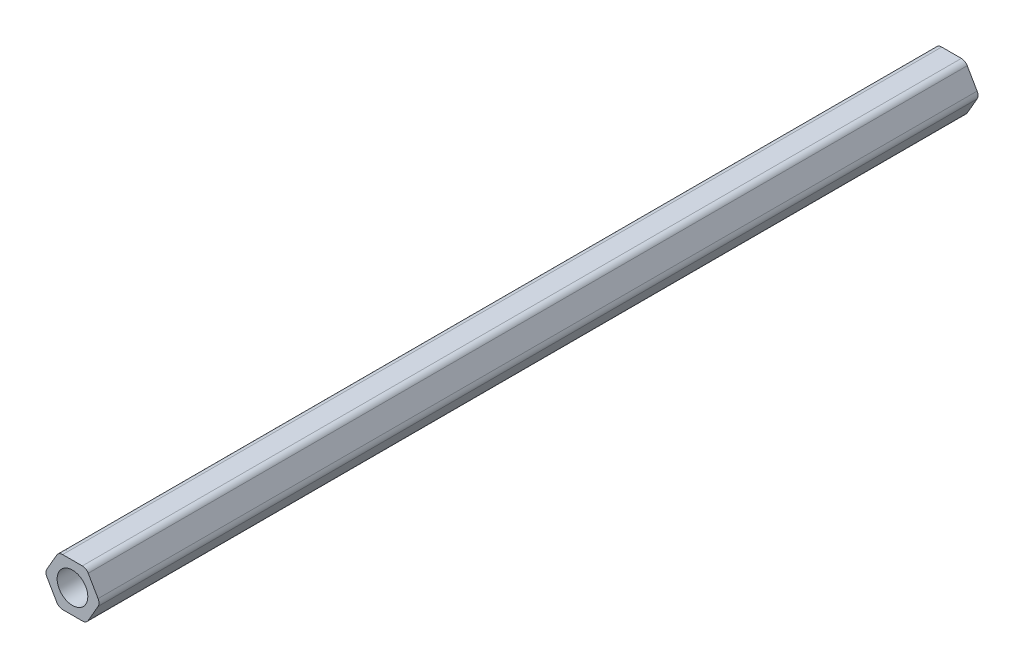
ISO-10303-21;
HEADER;
FILE_DESCRIPTION(('STEP AP214'),'2;1');
FILE_NAME('part.step','',(''),(''),'','','');
FILE_SCHEMA(('AUTOMOTIVE_DESIGN { 1 0 10303 214 1 1 1 1 }'));
ENDSEC;
DATA;
#1=APPLICATION_CONTEXT('core data for automotive mechanical design processes');
#2=APPLICATION_PROTOCOL_DEFINITION('international standard','automotive_design',2000,#1);
#3=PRODUCT_CONTEXT('',#1,'mechanical');
#4=PRODUCT('Part','Part','',(#3));
#5=PRODUCT_RELATED_PRODUCT_CATEGORY('part','',(#4));
#6=PRODUCT_DEFINITION_FORMATION('','',#4);
#7=PRODUCT_DEFINITION_CONTEXT('part definition',#1,'design');
#8=PRODUCT_DEFINITION('design','',#6,#7);
#9=PRODUCT_DEFINITION_SHAPE('','',#8);
#10=(LENGTH_UNIT() NAMED_UNIT(*) SI_UNIT(.MILLI.,.METRE.));
#11=(NAMED_UNIT(*) PLANE_ANGLE_UNIT() SI_UNIT($,.RADIAN.));
#12=(NAMED_UNIT(*) SI_UNIT($,.STERADIAN.) SOLID_ANGLE_UNIT());
#13=UNCERTAINTY_MEASURE_WITH_UNIT(LENGTH_MEASURE(1.E-05),#10,'distance_accuracy_value','');
#14=(GEOMETRIC_REPRESENTATION_CONTEXT(3) GLOBAL_UNCERTAINTY_ASSIGNED_CONTEXT((#13)) GLOBAL_UNIT_ASSIGNED_CONTEXT((#10,
#11,#12)) REPRESENTATION_CONTEXT('',''));
#15=CARTESIAN_POINT('',(0.,0.,0.));
#16=DIRECTION('',(0.,0.,1.));
#17=DIRECTION('',(1.,0.,0.));
#18=AXIS2_PLACEMENT_3D('',#15,#16,#17);
#19=CARTESIAN_POINT('',(-2.88675134594813,0.,129.));
#20=DIRECTION('',(0.,0.,-1.));
#21=DIRECTION('',(-1.,0.,0.));
#22=AXIS2_PLACEMENT_3D('',#19,#20,#21);
#23=CYLINDRICAL_SURFACE('',#22,1.);
#24=CARTESIAN_POINT('',(-2.88675134594813,0.,0.));
#25=DIRECTION('',(0.,0.,1.));
#26=DIRECTION('',(1.,0.,0.));
#27=AXIS2_PLACEMENT_3D('',#24,#25,#26);
#28=CIRCLE('',#27,1.);
#29=CARTESIAN_POINT('',(-3.75277674973257,0.500000000000003,0.));
#30=VERTEX_POINT('',#29);
#31=CARTESIAN_POINT('',(-3.75277674973257,-0.500000000000004,0.));
#32=VERTEX_POINT('',#31);
#33=EDGE_CURVE('E153',#30,#32,#28,.T.);
#34=ORIENTED_EDGE('',*,*,#33,.T.);
#35=DIRECTION('',(0.,0.,-1.));
#36=VECTOR('',#35,1.);
#37=CARTESIAN_POINT('',(-3.75277674973257,-0.500000000000004,129.));
#38=LINE('',#37,#36);
#39=CARTESIAN_POINT('',(-3.75277674973257,-0.500000000000004,129.));
#40=VERTEX_POINT('',#39);
#41=EDGE_CURVE('E11',#40,#32,#38,.T.);
#42=ORIENTED_EDGE('',*,*,#41,.F.);
#43=CARTESIAN_POINT('',(-2.88675134594813,0.,129.));
#44=DIRECTION('',(0.,0.,1.));
#45=DIRECTION('',(1.,0.,0.));
#46=AXIS2_PLACEMENT_3D('',#43,#44,#45);
#47=CIRCLE('',#46,1.);
#48=CARTESIAN_POINT('',(-3.75277674973257,0.500000000000003,129.));
#49=VERTEX_POINT('',#48);
#50=EDGE_CURVE('E176',#49,#40,#47,.T.);
#51=ORIENTED_EDGE('',*,*,#50,.F.);
#52=DIRECTION('',(0.,0.,-1.));
#53=VECTOR('',#52,1.);
#54=CARTESIAN_POINT('',(-3.75277674973257,0.500000000000003,129.));
#55=LINE('',#54,#53);
#56=EDGE_CURVE('E149',#49,#30,#55,.T.);
#57=ORIENTED_EDGE('',*,*,#56,.T.);
#58=EDGE_LOOP('',(#34,#42,#51,#57));
#59=FACE_BOUND('',#58,.T.);
#60=ADVANCED_FACE('F33',(#59),#23,.T.);
#61=CARTESIAN_POINT('',(-3.75277674973257,-0.500000000000004,129.));
#62=DIRECTION('',(0.866025403784439,0.5,0.));
#63=DIRECTION('',(-0.5,0.866025403784439,0.));
#64=AXIS2_PLACEMENT_3D('',#61,#62,#63);
#65=PLANE('',#64);
#66=DIRECTION('',(0.5,-0.866025403784439,0.));
#67=VECTOR('',#66,1.);
#68=CARTESIAN_POINT('',(-3.75277674973257,-0.500000000000004,0.));
#69=LINE('',#68,#67);
#70=CARTESIAN_POINT('',(-2.30940107675851,-3.,0.));
#71=VERTEX_POINT('',#70);
#72=EDGE_CURVE('E156',#32,#71,#69,.T.);
#73=ORIENTED_EDGE('',*,*,#72,.T.);
#74=DIRECTION('',(0.,0.,-1.));
#75=VECTOR('',#74,1.);
#76=CARTESIAN_POINT('',(-2.30940107675851,-3.,129.));
#77=LINE('',#76,#75);
#78=CARTESIAN_POINT('',(-2.30940107675851,-3.,129.));
#79=VERTEX_POINT('',#78);
#80=EDGE_CURVE('E41',#79,#71,#77,.T.);
#81=ORIENTED_EDGE('',*,*,#80,.F.);
#82=DIRECTION('',(0.5,-0.866025403784439,0.));
#83=VECTOR('',#82,1.);
#84=CARTESIAN_POINT('',(-3.75277674973257,-0.500000000000004,129.));
#85=LINE('',#84,#83);
#86=EDGE_CURVE('E104',#40,#79,#85,.T.);
#87=ORIENTED_EDGE('',*,*,#86,.F.);
#88=ORIENTED_EDGE('',*,*,#41,.T.);
#89=EDGE_LOOP('',(#73,#81,#87,#88));
#90=FACE_BOUND('',#89,.T.);
#91=ADVANCED_FACE('F255',(#90),#65,.F.);
#92=CARTESIAN_POINT('',(-1.44337567297407,-2.5,129.));
#93=DIRECTION('',(0.,0.,-1.));
#94=DIRECTION('',(-1.,0.,0.));
#95=AXIS2_PLACEMENT_3D('',#92,#93,#94);
#96=CYLINDRICAL_SURFACE('',#95,1.);
#97=CARTESIAN_POINT('',(-1.44337567297407,-2.5,0.));
#98=DIRECTION('',(0.,0.,1.));
#99=DIRECTION('',(1.,0.,0.));
#100=AXIS2_PLACEMENT_3D('',#97,#98,#99);
#101=CIRCLE('',#100,1.);
#102=CARTESIAN_POINT('',(-1.44337567297406,-3.5,0.));
#103=VERTEX_POINT('',#102);
#104=EDGE_CURVE('E159',#71,#103,#101,.T.);
#105=ORIENTED_EDGE('',*,*,#104,.T.);
#106=DIRECTION('',(0.,0.,-1.));
#107=VECTOR('',#106,1.);
#108=CARTESIAN_POINT('',(-1.44337567297406,-3.5,129.));
#109=LINE('',#108,#107);
#110=CARTESIAN_POINT('',(-1.44337567297406,-3.5,129.));
#111=VERTEX_POINT('',#110);
#112=EDGE_CURVE('E195',#111,#103,#109,.T.);
#113=ORIENTED_EDGE('',*,*,#112,.F.);
#114=CARTESIAN_POINT('',(-1.44337567297407,-2.5,129.));
#115=DIRECTION('',(0.,0.,1.));
#116=DIRECTION('',(1.,0.,0.));
#117=AXIS2_PLACEMENT_3D('',#114,#115,#116);
#118=CIRCLE('',#117,1.);
#119=EDGE_CURVE('E203',#79,#111,#118,.T.);
#120=ORIENTED_EDGE('',*,*,#119,.F.);
#121=ORIENTED_EDGE('',*,*,#80,.T.);
#122=EDGE_LOOP('',(#105,#113,#120,#121));
#123=FACE_BOUND('',#122,.T.);
#124=ADVANCED_FACE('F201',(#123),#96,.T.);
#125=CARTESIAN_POINT('',(-1.44337567297406,-3.5,129.));
#126=DIRECTION('',(0.,1.,0.));
#127=DIRECTION('',(-1.,0.,0.));
#128=AXIS2_PLACEMENT_3D('',#125,#126,#127);
#129=PLANE('',#128);
#130=DIRECTION('',(1.,0.,0.));
#131=VECTOR('',#130,1.);
#132=CARTESIAN_POINT('',(-1.44337567297406,-3.5,0.));
#133=LINE('',#132,#131);
#134=CARTESIAN_POINT('',(1.44337567297406,-3.5,0.));
#135=VERTEX_POINT('',#134);
#136=EDGE_CURVE('E161',#103,#135,#133,.T.);
#137=ORIENTED_EDGE('',*,*,#136,.T.);
#138=DIRECTION('',(0.,0.,-1.));
#139=VECTOR('',#138,1.);
#140=CARTESIAN_POINT('',(1.44337567297406,-3.5,129.));
#141=LINE('',#140,#139);
#142=CARTESIAN_POINT('',(1.44337567297406,-3.5,129.));
#143=VERTEX_POINT('',#142);
#144=EDGE_CURVE('E192',#143,#135,#141,.T.);
#145=ORIENTED_EDGE('',*,*,#144,.F.);
#146=DIRECTION('',(1.,0.,0.));
#147=VECTOR('',#146,1.);
#148=CARTESIAN_POINT('',(-1.44337567297406,-3.5,129.));
#149=LINE('',#148,#147);
#150=EDGE_CURVE('E221',#111,#143,#149,.T.);
#151=ORIENTED_EDGE('',*,*,#150,.F.);
#152=ORIENTED_EDGE('',*,*,#112,.T.);
#153=EDGE_LOOP('',(#137,#145,#151,#152));
#154=FACE_BOUND('',#153,.T.);
#155=ADVANCED_FACE('F212',(#154),#129,.F.);
#156=CARTESIAN_POINT('',(1.44337567297406,-2.5,129.));
#157=DIRECTION('',(0.,0.,-1.));
#158=DIRECTION('',(-1.,0.,0.));
#159=AXIS2_PLACEMENT_3D('',#156,#157,#158);
#160=CYLINDRICAL_SURFACE('',#159,1.);
#161=CARTESIAN_POINT('',(1.44337567297406,-2.5,0.));
#162=DIRECTION('',(0.,0.,1.));
#163=DIRECTION('',(1.,0.,0.));
#164=AXIS2_PLACEMENT_3D('',#161,#162,#163);
#165=CIRCLE('',#164,1.);
#166=CARTESIAN_POINT('',(2.30940107675851,-3.,0.));
#167=VERTEX_POINT('',#166);
#168=EDGE_CURVE('E163',#135,#167,#165,.T.);
#169=ORIENTED_EDGE('',*,*,#168,.T.);
#170=DIRECTION('',(0.,0.,-1.));
#171=VECTOR('',#170,1.);
#172=CARTESIAN_POINT('',(2.30940107675851,-3.,129.));
#173=LINE('',#172,#171);
#174=CARTESIAN_POINT('',(2.30940107675851,-3.,129.));
#175=VERTEX_POINT('',#174);
#176=EDGE_CURVE('E189',#175,#167,#173,.T.);
#177=ORIENTED_EDGE('',*,*,#176,.F.);
#178=CARTESIAN_POINT('',(1.44337567297406,-2.5,129.));
#179=DIRECTION('',(0.,0.,1.));
#180=DIRECTION('',(1.,0.,0.));
#181=AXIS2_PLACEMENT_3D('',#178,#179,#180);
#182=CIRCLE('',#181,1.);
#183=EDGE_CURVE('E218',#143,#175,#182,.T.);
#184=ORIENTED_EDGE('',*,*,#183,.F.);
#185=ORIENTED_EDGE('',*,*,#144,.T.);
#186=EDGE_LOOP('',(#169,#177,#184,#185));
#187=FACE_BOUND('',#186,.T.);
#188=ADVANCED_FACE('F216',(#187),#160,.T.);
#189=CARTESIAN_POINT('',(2.30940107675851,-3.,129.));
#190=DIRECTION('',(-0.866025403784439,0.5,0.));
#191=DIRECTION('',(-0.5,-0.866025403784439,0.));
#192=AXIS2_PLACEMENT_3D('',#189,#190,#191);
#193=PLANE('',#192);
#194=DIRECTION('',(0.5,0.866025403784439,0.));
#195=VECTOR('',#194,1.);
#196=CARTESIAN_POINT('',(2.30940107675851,-3.,0.));
#197=LINE('',#196,#195);
#198=CARTESIAN_POINT('',(3.75277674973256,-0.500000000000002,0.));
#199=VERTEX_POINT('',#198);
#200=EDGE_CURVE('E165',#167,#199,#197,.T.);
#201=ORIENTED_EDGE('',*,*,#200,.T.);
#202=DIRECTION('',(0.,0.,-1.));
#203=VECTOR('',#202,1.);
#204=CARTESIAN_POINT('',(3.75277674973256,-0.500000000000002,129.));
#205=LINE('',#204,#203);
#206=CARTESIAN_POINT('',(3.75277674973256,-0.500000000000002,129.));
#207=VERTEX_POINT('',#206);
#208=EDGE_CURVE('E186',#207,#199,#205,.T.);
#209=ORIENTED_EDGE('',*,*,#208,.F.);
#210=DIRECTION('',(0.5,0.866025403784439,0.));
#211=VECTOR('',#210,1.);
#212=CARTESIAN_POINT('',(2.30940107675851,-3.,129.));
#213=LINE('',#212,#211);
#214=EDGE_CURVE('E220',#175,#207,#213,.T.);
#215=ORIENTED_EDGE('',*,*,#214,.F.);
#216=ORIENTED_EDGE('',*,*,#176,.T.);
#217=EDGE_LOOP('',(#201,#209,#215,#216));
#218=FACE_BOUND('',#217,.T.);
#219=ADVANCED_FACE('F268',(#218),#193,.F.);
#220=CARTESIAN_POINT('',(2.88675134594813,0.,129.));
#221=DIRECTION('',(0.,0.,-1.));
#222=DIRECTION('',(-1.,0.,0.));
#223=AXIS2_PLACEMENT_3D('',#220,#221,#222);
#224=CYLINDRICAL_SURFACE('',#223,1.);
#225=CARTESIAN_POINT('',(2.88675134594813,0.,0.));
#226=DIRECTION('',(0.,0.,1.));
#227=DIRECTION('',(-1.,0.,0.));
#228=AXIS2_PLACEMENT_3D('',#225,#226,#227);
#229=CIRCLE('',#228,1.);
#230=CARTESIAN_POINT('',(3.75277674973256,0.500000000000006,0.));
#231=VERTEX_POINT('',#230);
#232=EDGE_CURVE('E167',#199,#231,#229,.T.);
#233=ORIENTED_EDGE('',*,*,#232,.T.);
#234=DIRECTION('',(0.,0.,-1.));
#235=VECTOR('',#234,1.);
#236=CARTESIAN_POINT('',(3.75277674973256,0.500000000000006,129.));
#237=LINE('',#236,#235);
#238=CARTESIAN_POINT('',(3.75277674973256,0.500000000000006,129.));
#239=VERTEX_POINT('',#238);
#240=EDGE_CURVE('E183',#239,#231,#237,.T.);
#241=ORIENTED_EDGE('',*,*,#240,.F.);
#242=CARTESIAN_POINT('',(2.88675134594813,0.,129.));
#243=DIRECTION('',(0.,0.,1.));
#244=DIRECTION('',(-1.,0.,0.));
#245=AXIS2_PLACEMENT_3D('',#242,#243,#244);
#246=CIRCLE('',#245,1.);
#247=EDGE_CURVE('E223',#207,#239,#246,.T.);
#248=ORIENTED_EDGE('',*,*,#247,.F.);
#249=ORIENTED_EDGE('',*,*,#208,.T.);
#250=EDGE_LOOP('',(#233,#241,#248,#249));
#251=FACE_BOUND('',#250,.T.);
#252=ADVANCED_FACE('F271',(#251),#224,.T.);
#253=CARTESIAN_POINT('',(3.75277674973256,0.500000000000006,129.));
#254=DIRECTION('',(-0.866025403784438,-0.5,0.));
#255=DIRECTION('',(0.5,-0.866025403784439,0.));
#256=AXIS2_PLACEMENT_3D('',#253,#254,#255);
#257=PLANE('',#256);
#258=DIRECTION('',(-0.5,0.866025403784439,0.));
#259=VECTOR('',#258,1.);
#260=CARTESIAN_POINT('',(3.75277674973256,0.500000000000006,0.));
#261=LINE('',#260,#259);
#262=CARTESIAN_POINT('',(2.3094010767585,3.,0.));
#263=VERTEX_POINT('',#262);
#264=EDGE_CURVE('E169',#231,#263,#261,.T.);
#265=ORIENTED_EDGE('',*,*,#264,.T.);
#266=DIRECTION('',(0.,0.,-1.));
#267=VECTOR('',#266,1.);
#268=CARTESIAN_POINT('',(2.3094010767585,3.,129.));
#269=LINE('',#268,#267);
#270=CARTESIAN_POINT('',(2.3094010767585,3.,129.));
#271=VERTEX_POINT('',#270);
#272=EDGE_CURVE('E180',#271,#263,#269,.T.);
#273=ORIENTED_EDGE('',*,*,#272,.F.);
#274=DIRECTION('',(-0.5,0.866025403784439,0.));
#275=VECTOR('',#274,1.);
#276=CARTESIAN_POINT('',(3.75277674973256,0.500000000000006,129.));
#277=LINE('',#276,#275);
#278=EDGE_CURVE('E229',#239,#271,#277,.T.);
#279=ORIENTED_EDGE('',*,*,#278,.F.);
#280=ORIENTED_EDGE('',*,*,#240,.T.);
#281=EDGE_LOOP('',(#265,#273,#279,#280));
#282=FACE_BOUND('',#281,.T.);
#283=ADVANCED_FACE('F235',(#282),#257,.F.);
#284=CARTESIAN_POINT('',(1.44337567297406,2.5,129.));
#285=DIRECTION('',(0.,0.,-1.));
#286=DIRECTION('',(-1.,0.,0.));
#287=AXIS2_PLACEMENT_3D('',#284,#285,#286);
#288=CYLINDRICAL_SURFACE('',#287,1.);
#289=CARTESIAN_POINT('',(1.44337567297406,2.5,0.));
#290=DIRECTION('',(0.,0.,1.));
#291=DIRECTION('',(1.,0.,0.));
#292=AXIS2_PLACEMENT_3D('',#289,#290,#291);
#293=CIRCLE('',#292,1.);
#294=CARTESIAN_POINT('',(1.44337567297406,3.5,0.));
#295=VERTEX_POINT('',#294);
#296=EDGE_CURVE('E171',#263,#295,#293,.T.);
#297=ORIENTED_EDGE('',*,*,#296,.T.);
#298=DIRECTION('',(0.,0.,-1.));
#299=VECTOR('',#298,1.);
#300=CARTESIAN_POINT('',(1.44337567297406,3.5,129.));
#301=LINE('',#300,#299);
#302=CARTESIAN_POINT('',(1.44337567297406,3.5,129.));
#303=VERTEX_POINT('',#302);
#304=EDGE_CURVE('E144',#303,#295,#301,.T.);
#305=ORIENTED_EDGE('',*,*,#304,.F.);
#306=CARTESIAN_POINT('',(1.44337567297406,2.5,129.));
#307=DIRECTION('',(0.,0.,1.));
#308=DIRECTION('',(1.,0.,0.));
#309=AXIS2_PLACEMENT_3D('',#306,#307,#308);
#310=CIRCLE('',#309,1.);
#311=EDGE_CURVE('E135',#271,#303,#310,.T.);
#312=ORIENTED_EDGE('',*,*,#311,.F.);
#313=ORIENTED_EDGE('',*,*,#272,.T.);
#314=EDGE_LOOP('',(#297,#305,#312,#313));
#315=FACE_BOUND('',#314,.T.);
#316=ADVANCED_FACE('F239',(#315),#288,.T.);
#317=CARTESIAN_POINT('',(1.44337567297406,3.5,129.));
#318=DIRECTION('',(0.,-1.,0.));
#319=DIRECTION('',(0.,0.,-1.));
#320=AXIS2_PLACEMENT_3D('',#317,#318,#319);
#321=PLANE('',#320);
#322=DIRECTION('',(-1.,0.,0.));
#323=VECTOR('',#322,1.);
#324=CARTESIAN_POINT('',(1.44337567297406,3.5,0.));
#325=LINE('',#324,#323);
#326=CARTESIAN_POINT('',(-1.44337567297406,3.5,0.));
#327=VERTEX_POINT('',#326);
#328=EDGE_CURVE('E143',#295,#327,#325,.T.);
#329=ORIENTED_EDGE('',*,*,#328,.T.);
#330=DIRECTION('',(0.,0.,-1.));
#331=VECTOR('',#330,1.);
#332=CARTESIAN_POINT('',(-1.44337567297406,3.5,129.));
#333=LINE('',#332,#331);
#334=CARTESIAN_POINT('',(-1.44337567297406,3.5,129.));
#335=VERTEX_POINT('',#334);
#336=EDGE_CURVE('E140',#335,#327,#333,.T.);
#337=ORIENTED_EDGE('',*,*,#336,.F.);
#338=DIRECTION('',(-1.,0.,0.));
#339=VECTOR('',#338,1.);
#340=CARTESIAN_POINT('',(1.44337567297406,3.5,129.));
#341=LINE('',#340,#339);
#342=EDGE_CURVE('E129',#303,#335,#341,.T.);
#343=ORIENTED_EDGE('',*,*,#342,.F.);
#344=ORIENTED_EDGE('',*,*,#304,.T.);
#345=EDGE_LOOP('',(#329,#337,#343,#344));
#346=FACE_BOUND('',#345,.T.);
#347=ADVANCED_FACE('F141',(#346),#321,.F.);
#348=CARTESIAN_POINT('',(-1.44337567297407,2.5,129.));
#349=DIRECTION('',(0.,0.,-1.));
#350=DIRECTION('',(-1.,0.,0.));
#351=AXIS2_PLACEMENT_3D('',#348,#349,#350);
#352=CYLINDRICAL_SURFACE('',#351,1.);
#353=CARTESIAN_POINT('',(-1.44337567297407,2.5,0.));
#354=DIRECTION('',(0.,0.,1.));
#355=DIRECTION('',(1.,0.,0.));
#356=AXIS2_PLACEMENT_3D('',#353,#354,#355);
#357=CIRCLE('',#356,1.);
#358=CARTESIAN_POINT('',(-2.30940107675851,3.,0.));
#359=VERTEX_POINT('',#358);
#360=EDGE_CURVE('E90',#327,#359,#357,.T.);
#361=ORIENTED_EDGE('',*,*,#360,.T.);
#362=DIRECTION('',(0.,0.,-1.));
#363=VECTOR('',#362,1.);
#364=CARTESIAN_POINT('',(-2.30940107675851,3.,129.));
#365=LINE('',#364,#363);
#366=CARTESIAN_POINT('',(-2.30940107675851,3.,129.));
#367=VERTEX_POINT('',#366);
#368=EDGE_CURVE('E145',#367,#359,#365,.T.);
#369=ORIENTED_EDGE('',*,*,#368,.F.);
#370=CARTESIAN_POINT('',(-1.44337567297407,2.5,129.));
#371=DIRECTION('',(0.,0.,1.));
#372=DIRECTION('',(1.,0.,0.));
#373=AXIS2_PLACEMENT_3D('',#370,#371,#372);
#374=CIRCLE('',#373,1.);
#375=EDGE_CURVE('E133',#335,#367,#374,.T.);
#376=ORIENTED_EDGE('',*,*,#375,.F.);
#377=ORIENTED_EDGE('',*,*,#336,.T.);
#378=EDGE_LOOP('',(#361,#369,#376,#377));
#379=FACE_BOUND('',#378,.T.);
#380=ADVANCED_FACE('F147',(#379),#352,.T.);
#381=CARTESIAN_POINT('',(-2.30940107675851,3.,129.));
#382=DIRECTION('',(0.866025403784439,-0.5,0.));
#383=DIRECTION('',(0.5,0.866025403784439,0.));
#384=AXIS2_PLACEMENT_3D('',#381,#382,#383);
#385=PLANE('',#384);
#386=DIRECTION('',(-0.5,-0.866025403784439,0.));
#387=VECTOR('',#386,1.);
#388=CARTESIAN_POINT('',(-2.30940107675851,3.,0.));
#389=LINE('',#388,#387);
#390=EDGE_CURVE('E96',#359,#30,#389,.T.);
#391=ORIENTED_EDGE('',*,*,#390,.T.);
#392=ORIENTED_EDGE('',*,*,#56,.F.);
#393=DIRECTION('',(-0.5,-0.866025403784439,0.));
#394=VECTOR('',#393,1.);
#395=CARTESIAN_POINT('',(-2.30940107675851,3.,129.));
#396=LINE('',#395,#394);
#397=EDGE_CURVE('E49',#367,#49,#396,.T.);
#398=ORIENTED_EDGE('',*,*,#397,.F.);
#399=ORIENTED_EDGE('',*,*,#368,.T.);
#400=EDGE_LOOP('',(#391,#392,#398,#399));
#401=FACE_BOUND('',#400,.T.);
#402=ADVANCED_FACE('F243',(#401),#385,.F.);
#403=CARTESIAN_POINT('',(-2.88675134594813,0.,129.));
#404=DIRECTION('',(0.,0.,1.));
#405=DIRECTION('',(1.,0.,0.));
#406=AXIS2_PLACEMENT_3D('',#403,#404,#405);
#407=PLANE('',#406);
#408=CARTESIAN_POINT('',(0.,0.,129.));
#409=DIRECTION('',(0.,0.,1.));
#410=DIRECTION('',(1.,0.,0.));
#411=AXIS2_PLACEMENT_3D('',#408,#409,#410);
#412=CIRCLE('',#411,2.25);
#413=CARTESIAN_POINT('',(2.25,0.,129.));
#414=VERTEX_POINT('',#413);
#415=EDGE_CURVE('E354',#414,#414,#412,.T.);
#416=ORIENTED_EDGE('',*,*,#415,.F.);
#417=EDGE_LOOP('',(#416));
#418=FACE_BOUND('',#417,.T.);
#419=ORIENTED_EDGE('',*,*,#50,.T.);
#420=ORIENTED_EDGE('',*,*,#86,.T.);
#421=ORIENTED_EDGE('',*,*,#119,.T.);
#422=ORIENTED_EDGE('',*,*,#150,.T.);
#423=ORIENTED_EDGE('',*,*,#183,.T.);
#424=ORIENTED_EDGE('',*,*,#214,.T.);
#425=ORIENTED_EDGE('',*,*,#247,.T.);
#426=ORIENTED_EDGE('',*,*,#278,.T.);
#427=ORIENTED_EDGE('',*,*,#311,.T.);
#428=ORIENTED_EDGE('',*,*,#342,.T.);
#429=ORIENTED_EDGE('',*,*,#375,.T.);
#430=ORIENTED_EDGE('',*,*,#397,.T.);
#431=EDGE_LOOP('',(#419,#420,#421,#422,#423,#424,#425,#426,#427,#428,#429,#430));
#432=FACE_BOUND('',#431,.T.);
#433=ADVANCED_FACE('F131',(#418,#432),#407,.T.);
#434=CARTESIAN_POINT('',(-2.88675134594813,0.,0.));
#435=DIRECTION('',(0.,0.,1.));
#436=DIRECTION('',(1.,0.,0.));
#437=AXIS2_PLACEMENT_3D('',#434,#435,#436);
#438=PLANE('',#437);
#439=CARTESIAN_POINT('',(0.,0.,0.));
#440=DIRECTION('',(0.,0.,-1.));
#441=DIRECTION('',(-1.,0.,0.));
#442=AXIS2_PLACEMENT_3D('',#439,#440,#441);
#443=CIRCLE('',#442,2.25);
#444=CARTESIAN_POINT('',(-2.25,0.,0.));
#445=VERTEX_POINT('',#444);
#446=EDGE_CURVE('E355',#445,#445,#443,.T.);
#447=ORIENTED_EDGE('',*,*,#446,.F.);
#448=EDGE_LOOP('',(#447));
#449=FACE_BOUND('',#448,.T.);
#450=ORIENTED_EDGE('',*,*,#33,.F.);
#451=ORIENTED_EDGE('',*,*,#390,.F.);
#452=ORIENTED_EDGE('',*,*,#360,.F.);
#453=ORIENTED_EDGE('',*,*,#328,.F.);
#454=ORIENTED_EDGE('',*,*,#296,.F.);
#455=ORIENTED_EDGE('',*,*,#264,.F.);
#456=ORIENTED_EDGE('',*,*,#232,.F.);
#457=ORIENTED_EDGE('',*,*,#200,.F.);
#458=ORIENTED_EDGE('',*,*,#168,.F.);
#459=ORIENTED_EDGE('',*,*,#136,.F.);
#460=ORIENTED_EDGE('',*,*,#104,.F.);
#461=ORIENTED_EDGE('',*,*,#72,.F.);
#462=EDGE_LOOP('',(#450,#451,#452,#453,#454,#455,#456,#457,#458,#459,#460,#461));
#463=FACE_BOUND('',#462,.T.);
#464=ADVANCED_FACE('F207',(#449,#463),#438,.F.);
#465=CARTESIAN_POINT('',(0.,0.,123.));
#466=DIRECTION('',(0.,0.,1.));
#467=DIRECTION('',(1.,0.,0.));
#468=AXIS2_PLACEMENT_3D('',#465,#466,#467);
#469=CYLINDRICAL_SURFACE('',#468,2.25);
#470=CARTESIAN_POINT('',(0.,0.,123.));
#471=DIRECTION('',(0.,0.,1.));
#472=DIRECTION('',(1.,0.,0.));
#473=AXIS2_PLACEMENT_3D('',#470,#471,#472);
#474=CIRCLE('',#473,2.25);
#475=CARTESIAN_POINT('',(2.25,0.,123.));
#476=VERTEX_POINT('',#475);
#477=EDGE_CURVE('E157',#476,#476,#474,.T.);
#478=ORIENTED_EDGE('',*,*,#477,.F.);
#479=EDGE_LOOP('',(#478));
#480=FACE_BOUND('',#479,.T.);
#481=ORIENTED_EDGE('',*,*,#415,.T.);
#482=EDGE_LOOP('',(#481));
#483=FACE_BOUND('',#482,.T.);
#484=ADVANCED_FACE('F306',(#480,#483),#469,.F.);
#485=CARTESIAN_POINT('',(0.,0.,123.));
#486=DIRECTION('',(0.,0.,1.));
#487=DIRECTION('',(1.,0.,0.));
#488=AXIS2_PLACEMENT_3D('',#485,#486,#487);
#489=PLANE('',#488);
#490=ORIENTED_EDGE('',*,*,#477,.T.);
#491=EDGE_LOOP('',(#490));
#492=FACE_BOUND('',#491,.T.);
#493=ADVANCED_FACE('F311',(#492),#489,.T.);
#494=CARTESIAN_POINT('',(0.,0.,6.));
#495=DIRECTION('',(0.,0.,-1.));
#496=DIRECTION('',(-1.,0.,0.));
#497=AXIS2_PLACEMENT_3D('',#494,#495,#496);
#498=CYLINDRICAL_SURFACE('',#497,2.25);
#499=CARTESIAN_POINT('',(0.,0.,6.));
#500=DIRECTION('',(0.,0.,-1.));
#501=DIRECTION('',(-1.,0.,0.));
#502=AXIS2_PLACEMENT_3D('',#499,#500,#501);
#503=CIRCLE('',#502,2.25);
#504=CARTESIAN_POINT('',(-2.25,0.,6.));
#505=VERTEX_POINT('',#504);
#506=EDGE_CURVE('E353',#505,#505,#503,.T.);
#507=ORIENTED_EDGE('',*,*,#506,.F.);
#508=EDGE_LOOP('',(#507));
#509=FACE_BOUND('',#508,.T.);
#510=ORIENTED_EDGE('',*,*,#446,.T.);
#511=EDGE_LOOP('',(#510));
#512=FACE_BOUND('',#511,.T.);
#513=ADVANCED_FACE('F321',(#509,#512),#498,.F.);
#514=CARTESIAN_POINT('',(0.,0.,6.));
#515=DIRECTION('',(0.,0.,-1.));
#516=DIRECTION('',(-1.,0.,0.));
#517=AXIS2_PLACEMENT_3D('',#514,#515,#516);
#518=PLANE('',#517);
#519=ORIENTED_EDGE('',*,*,#506,.T.);
#520=EDGE_LOOP('',(#519));
#521=FACE_BOUND('',#520,.T.);
#522=ADVANCED_FACE('F337',(#521),#518,.T.);
#523=CLOSED_SHELL('',(#60,#91,#124,#155,#188,#219,#252,#283,#316,#347,#380,#402,#433,#464,#484,
#493,#513,#522));
#524=MANIFOLD_SOLID_BREP('B2',#523);
#525=ADVANCED_BREP_SHAPE_REPRESENTATION('',(#18,#524),#14);
#526=SHAPE_DEFINITION_REPRESENTATION(#9,#525);
ENDSEC;
END-ISO-10303-21;
